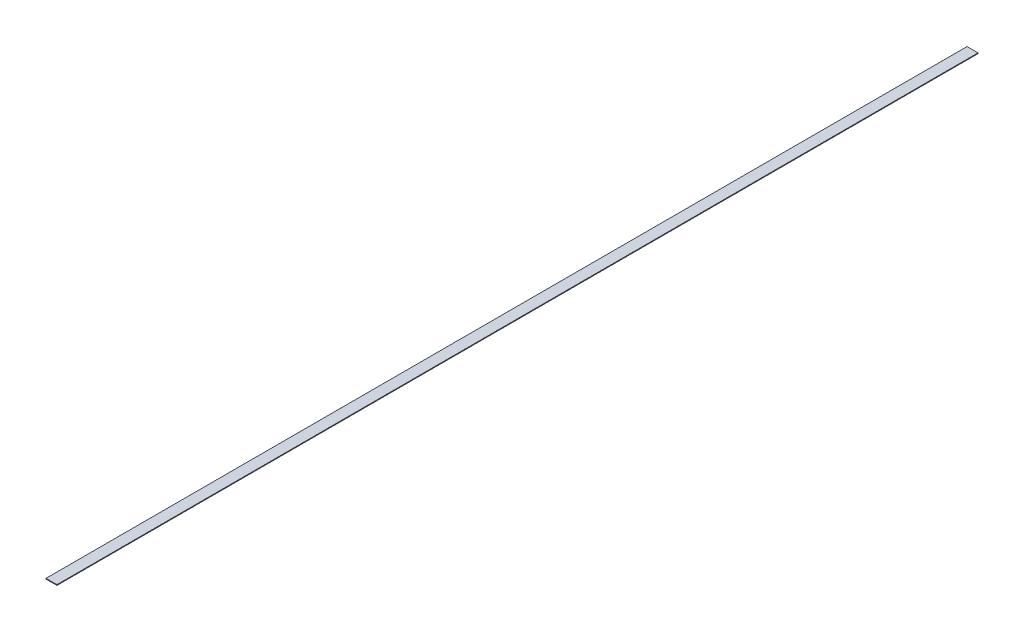
ISO-10303-21;
HEADER;
FILE_DESCRIPTION(('STEP AP214'),'2;1');
FILE_NAME('part.step','',(''),(''),'','','');
FILE_SCHEMA(('AUTOMOTIVE_DESIGN { 1 0 10303 214 1 1 1 1 }'));
ENDSEC;
DATA;
#1=APPLICATION_CONTEXT('core data for automotive mechanical design processes');
#2=APPLICATION_PROTOCOL_DEFINITION('international standard','automotive_design',2000,#1);
#3=PRODUCT_CONTEXT('',#1,'mechanical');
#4=PRODUCT('Part','Part','',(#3));
#5=PRODUCT_RELATED_PRODUCT_CATEGORY('part','',(#4));
#6=PRODUCT_DEFINITION_FORMATION('','',#4);
#7=PRODUCT_DEFINITION_CONTEXT('part definition',#1,'design');
#8=PRODUCT_DEFINITION('design','',#6,#7);
#9=PRODUCT_DEFINITION_SHAPE('','',#8);
#10=(LENGTH_UNIT() NAMED_UNIT(*) SI_UNIT(.MILLI.,.METRE.));
#11=(NAMED_UNIT(*) PLANE_ANGLE_UNIT() SI_UNIT($,.RADIAN.));
#12=(NAMED_UNIT(*) SI_UNIT($,.STERADIAN.) SOLID_ANGLE_UNIT());
#13=UNCERTAINTY_MEASURE_WITH_UNIT(LENGTH_MEASURE(1.E-05),#10,'distance_accuracy_value','');
#14=(GEOMETRIC_REPRESENTATION_CONTEXT(3) GLOBAL_UNCERTAINTY_ASSIGNED_CONTEXT((#13)) GLOBAL_UNIT_ASSIGNED_CONTEXT((#10,
#11,#12)) REPRESENTATION_CONTEXT('',''));
#15=CARTESIAN_POINT('',(0.,0.,0.));
#16=DIRECTION('',(0.,0.,1.));
#17=DIRECTION('',(1.,0.,0.));
#18=AXIS2_PLACEMENT_3D('',#15,#16,#17);
#19=CARTESIAN_POINT('',(-25.4,-1.5875,4267.2));
#20=DIRECTION('',(1.,0.,0.));
#21=DIRECTION('',(0.,0.,-1.));
#22=AXIS2_PLACEMENT_3D('',#19,#20,#21);
#23=PLANE('',#22);
#24=DIRECTION('',(0.,-1.,0.));
#25=VECTOR('',#24,1.);
#26=CARTESIAN_POINT('',(-25.4,-1.5875,0.));
#27=LINE('',#26,#25);
#28=CARTESIAN_POINT('',(-25.4,1.5875,0.));
#29=VERTEX_POINT('',#28);
#30=CARTESIAN_POINT('',(-25.4,-1.5875,0.));
#31=VERTEX_POINT('',#30);
#32=EDGE_CURVE('E101',#29,#31,#27,.T.);
#33=ORIENTED_EDGE('',*,*,#32,.T.);
#34=DIRECTION('',(0.,0.,-1.));
#35=VECTOR('',#34,1.);
#36=CARTESIAN_POINT('',(-25.4,-1.5875,4267.2));
#37=LINE('',#36,#35);
#38=CARTESIAN_POINT('',(-25.4,-1.5875,4267.2));
#39=VERTEX_POINT('',#38);
#40=EDGE_CURVE('E11',#39,#31,#37,.T.);
#41=ORIENTED_EDGE('',*,*,#40,.F.);
#42=DIRECTION('',(0.,-1.,0.));
#43=VECTOR('',#42,1.);
#44=CARTESIAN_POINT('',(-25.4,-1.5875,4267.2));
#45=LINE('',#44,#43);
#46=CARTESIAN_POINT('',(-25.4,1.5875,4267.2));
#47=VERTEX_POINT('',#46);
#48=EDGE_CURVE('E88',#47,#39,#45,.T.);
#49=ORIENTED_EDGE('',*,*,#48,.F.);
#50=DIRECTION('',(0.,0.,-1.));
#51=VECTOR('',#50,1.);
#52=CARTESIAN_POINT('',(-25.4,1.5875,4267.2));
#53=LINE('',#52,#51);
#54=EDGE_CURVE('E97',#47,#29,#53,.T.);
#55=ORIENTED_EDGE('',*,*,#54,.T.);
#56=EDGE_LOOP('',(#33,#41,#49,#55));
#57=FACE_BOUND('',#56,.T.);
#58=ADVANCED_FACE('F36',(#57),#23,.F.);
#59=CARTESIAN_POINT('',(25.4,-1.5875,4267.2));
#60=DIRECTION('',(0.,1.,0.));
#61=DIRECTION('',(-1.,0.,0.));
#62=AXIS2_PLACEMENT_3D('',#59,#60,#61);
#63=PLANE('',#62);
#64=DIRECTION('',(1.,0.,0.));
#65=VECTOR('',#64,1.);
#66=CARTESIAN_POINT('',(25.4,-1.5875,0.));
#67=LINE('',#66,#65);
#68=CARTESIAN_POINT('',(25.4,-1.5875,0.));
#69=VERTEX_POINT('',#68);
#70=EDGE_CURVE('E92',#31,#69,#67,.T.);
#71=ORIENTED_EDGE('',*,*,#70,.T.);
#72=DIRECTION('',(0.,0.,-1.));
#73=VECTOR('',#72,1.);
#74=CARTESIAN_POINT('',(25.4,-1.5875,4267.2));
#75=LINE('',#74,#73);
#76=CARTESIAN_POINT('',(25.4,-1.5875,4267.2));
#77=VERTEX_POINT('',#76);
#78=EDGE_CURVE('E45',#77,#69,#75,.T.);
#79=ORIENTED_EDGE('',*,*,#78,.F.);
#80=DIRECTION('',(1.,0.,0.));
#81=VECTOR('',#80,1.);
#82=CARTESIAN_POINT('',(25.4,-1.5875,4267.2));
#83=LINE('',#82,#81);
#84=EDGE_CURVE('E83',#39,#77,#83,.T.);
#85=ORIENTED_EDGE('',*,*,#84,.F.);
#86=ORIENTED_EDGE('',*,*,#40,.T.);
#87=EDGE_LOOP('',(#71,#79,#85,#86));
#88=FACE_BOUND('',#87,.T.);
#89=ADVANCED_FACE('F91',(#88),#63,.F.);
#90=CARTESIAN_POINT('',(25.4,-1.5875,4267.2));
#91=DIRECTION('',(-1.,0.,0.));
#92=DIRECTION('',(0.,0.,1.));
#93=AXIS2_PLACEMENT_3D('',#90,#91,#92);
#94=PLANE('',#93);
#95=DIRECTION('',(0.,1.,0.));
#96=VECTOR('',#95,1.);
#97=CARTESIAN_POINT('',(25.4,-1.5875,0.));
#98=LINE('',#97,#96);
#99=CARTESIAN_POINT('',(25.4,1.5875,0.));
#100=VERTEX_POINT('',#99);
#101=EDGE_CURVE('E70',#69,#100,#98,.T.);
#102=ORIENTED_EDGE('',*,*,#101,.T.);
#103=DIRECTION('',(0.,0.,-1.));
#104=VECTOR('',#103,1.);
#105=CARTESIAN_POINT('',(25.4,1.5875,4267.2));
#106=LINE('',#105,#104);
#107=CARTESIAN_POINT('',(25.4,1.5875,4267.2));
#108=VERTEX_POINT('',#107);
#109=EDGE_CURVE('E94',#108,#100,#106,.T.);
#110=ORIENTED_EDGE('',*,*,#109,.F.);
#111=DIRECTION('',(0.,1.,0.));
#112=VECTOR('',#111,1.);
#113=CARTESIAN_POINT('',(25.4,-1.5875,4267.2));
#114=LINE('',#113,#112);
#115=EDGE_CURVE('E86',#77,#108,#114,.T.);
#116=ORIENTED_EDGE('',*,*,#115,.F.);
#117=ORIENTED_EDGE('',*,*,#78,.T.);
#118=EDGE_LOOP('',(#102,#110,#116,#117));
#119=FACE_BOUND('',#118,.T.);
#120=ADVANCED_FACE('F95',(#119),#94,.F.);
#121=CARTESIAN_POINT('',(25.4,1.5875,4267.2));
#122=DIRECTION('',(0.,-1.,0.));
#123=DIRECTION('',(1.,0.,0.));
#124=AXIS2_PLACEMENT_3D('',#121,#122,#123);
#125=PLANE('',#124);
#126=DIRECTION('',(-1.,0.,0.));
#127=VECTOR('',#126,1.);
#128=CARTESIAN_POINT('',(25.4,1.5875,0.));
#129=LINE('',#128,#127);
#130=EDGE_CURVE('E76',#100,#29,#129,.T.);
#131=ORIENTED_EDGE('',*,*,#130,.T.);
#132=ORIENTED_EDGE('',*,*,#54,.F.);
#133=DIRECTION('',(-1.,0.,0.));
#134=VECTOR('',#133,1.);
#135=CARTESIAN_POINT('',(25.4,1.5875,4267.2));
#136=LINE('',#135,#134);
#137=EDGE_CURVE('E53',#108,#47,#136,.T.);
#138=ORIENTED_EDGE('',*,*,#137,.F.);
#139=ORIENTED_EDGE('',*,*,#109,.T.);
#140=EDGE_LOOP('',(#131,#132,#138,#139));
#141=FACE_BOUND('',#140,.T.);
#142=ADVANCED_FACE('F110',(#141),#125,.F.);
#143=CARTESIAN_POINT('',(-25.4,1.5875,4267.2));
#144=DIRECTION('',(0.,0.,1.));
#145=DIRECTION('',(1.,0.,0.));
#146=AXIS2_PLACEMENT_3D('',#143,#144,#145);
#147=PLANE('',#146);
#148=ORIENTED_EDGE('',*,*,#48,.T.);
#149=ORIENTED_EDGE('',*,*,#84,.T.);
#150=ORIENTED_EDGE('',*,*,#115,.T.);
#151=ORIENTED_EDGE('',*,*,#137,.T.);
#152=EDGE_LOOP('',(#148,#149,#150,#151));
#153=FACE_BOUND('',#152,.T.);
#154=ADVANCED_FACE('F84',(#153),#147,.T.);
#155=CARTESIAN_POINT('',(-25.4,1.5875,0.));
#156=DIRECTION('',(0.,0.,1.));
#157=DIRECTION('',(1.,0.,0.));
#158=AXIS2_PLACEMENT_3D('',#155,#156,#157);
#159=PLANE('',#158);
#160=ORIENTED_EDGE('',*,*,#32,.F.);
#161=ORIENTED_EDGE('',*,*,#130,.F.);
#162=ORIENTED_EDGE('',*,*,#101,.F.);
#163=ORIENTED_EDGE('',*,*,#70,.F.);
#164=EDGE_LOOP('',(#160,#161,#162,#163));
#165=FACE_BOUND('',#164,.T.);
#166=ADVANCED_FACE('F113',(#165),#159,.F.);
#167=CLOSED_SHELL('',(#58,#89,#120,#142,#154,#166));
#168=MANIFOLD_SOLID_BREP('B2',#167);
#169=ADVANCED_BREP_SHAPE_REPRESENTATION('',(#18,#168),#14);
#170=SHAPE_DEFINITION_REPRESENTATION(#9,#169);
ENDSEC;
END-ISO-10303-21;
